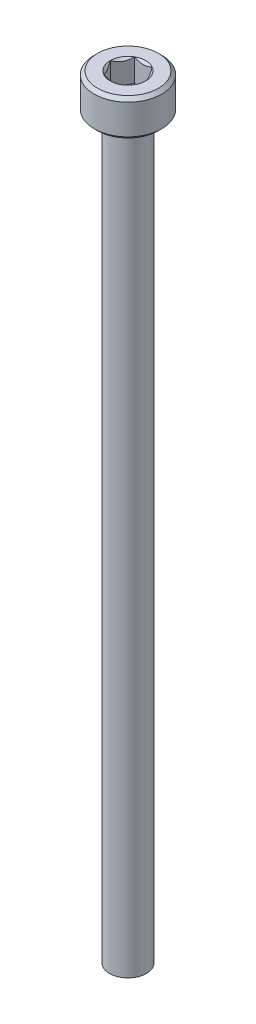
ISO-10303-21;
HEADER;
FILE_DESCRIPTION(('STEP AP214'),'2;1');
FILE_NAME('part.step','',(''),(''),'','','');
FILE_SCHEMA(('AUTOMOTIVE_DESIGN { 1 0 10303 214 1 1 1 1 }'));
ENDSEC;
DATA;
#1=APPLICATION_CONTEXT('core data for automotive mechanical design processes');
#2=APPLICATION_PROTOCOL_DEFINITION('international standard','automotive_design',2000,#1);
#3=PRODUCT_CONTEXT('',#1,'mechanical');
#4=PRODUCT('Part','Part','',(#3));
#5=PRODUCT_RELATED_PRODUCT_CATEGORY('part','',(#4));
#6=PRODUCT_DEFINITION_FORMATION('','',#4);
#7=PRODUCT_DEFINITION_CONTEXT('part definition',#1,'design');
#8=PRODUCT_DEFINITION('design','',#6,#7);
#9=PRODUCT_DEFINITION_SHAPE('','',#8);
#10=(LENGTH_UNIT() NAMED_UNIT(*) SI_UNIT(.MILLI.,.METRE.));
#11=(NAMED_UNIT(*) PLANE_ANGLE_UNIT() SI_UNIT($,.RADIAN.));
#12=(NAMED_UNIT(*) SI_UNIT($,.STERADIAN.) SOLID_ANGLE_UNIT());
#13=UNCERTAINTY_MEASURE_WITH_UNIT(LENGTH_MEASURE(1.E-05),#10,'distance_accuracy_value','');
#14=(GEOMETRIC_REPRESENTATION_CONTEXT(3) GLOBAL_UNCERTAINTY_ASSIGNED_CONTEXT((#13)) GLOBAL_UNIT_ASSIGNED_CONTEXT((#10,
#11,#12)) REPRESENTATION_CONTEXT('',''));
#15=CARTESIAN_POINT('',(0.,0.,0.));
#16=DIRECTION('',(0.,0.,1.));
#17=DIRECTION('',(1.,0.,0.));
#18=AXIS2_PLACEMENT_3D('',#15,#16,#17);
#19=CARTESIAN_POINT('',(0.,3.,0.));
#20=DIRECTION('',(0.,-1.,0.));
#21=DIRECTION('',(0.,0.,-1.));
#22=AXIS2_PLACEMENT_3D('',#19,#20,#21);
#23=CYLINDRICAL_SURFACE('',#22,2.75);
#24=CARTESIAN_POINT('',(0.,0.275000000000001,0.));
#25=DIRECTION('',(0.,1.,0.));
#26=DIRECTION('',(0.,0.,1.));
#27=AXIS2_PLACEMENT_3D('',#24,#25,#26);
#28=CIRCLE('',#27,2.75);
#29=CARTESIAN_POINT('',(0.,0.275000000000001,2.75));
#30=VERTEX_POINT('',#29);
#31=EDGE_CURVE('E227',#30,#30,#28,.T.);
#32=ORIENTED_EDGE('',*,*,#31,.T.);
#33=EDGE_LOOP('',(#32));
#34=FACE_BOUND('',#33,.T.);
#35=CARTESIAN_POINT('',(0.,2.725,0.));
#36=DIRECTION('',(0.,1.,0.));
#37=DIRECTION('',(0.,0.,1.));
#38=AXIS2_PLACEMENT_3D('',#35,#36,#37);
#39=CIRCLE('',#38,2.75);
#40=CARTESIAN_POINT('',(0.,2.725,2.75));
#41=VERTEX_POINT('',#40);
#42=EDGE_CURVE('E104',#41,#41,#39,.F.);
#43=ORIENTED_EDGE('',*,*,#42,.T.);
#44=EDGE_LOOP('',(#43));
#45=FACE_BOUND('',#44,.T.);
#46=ADVANCED_FACE('F32',(#34,#45),#23,.T.);
#47=CARTESIAN_POINT('',(0.,3.,0.));
#48=DIRECTION('',(0.,1.,0.));
#49=DIRECTION('',(0.,0.,1.));
#50=AXIS2_PLACEMENT_3D('',#47,#48,#49);
#51=PLANE('',#50);
#52=CARTESIAN_POINT('',(0.,3.,0.));
#53=DIRECTION('',(0.,1.,0.));
#54=DIRECTION('',(0.,0.,1.));
#55=AXIS2_PLACEMENT_3D('',#52,#53,#54);
#56=CIRCLE('',#55,2.475);
#57=CARTESIAN_POINT('',(0.,3.,2.475));
#58=VERTEX_POINT('',#57);
#59=EDGE_CURVE('E36',#58,#58,#56,.T.);
#60=ORIENTED_EDGE('',*,*,#59,.T.);
#61=EDGE_LOOP('',(#60));
#62=FACE_BOUND('',#61,.T.);
#63=CARTESIAN_POINT('',(0.,3.,0.));
#64=DIRECTION('',(0.,1.,0.));
#65=DIRECTION('',(0.,0.,1.));
#66=AXIS2_PLACEMENT_3D('',#63,#64,#65);
#67=CIRCLE('',#66,1.44337567297406);
#68=CARTESIAN_POINT('',(0.721687836487033,3.,1.25));
#69=VERTEX_POINT('',#68);
#70=CARTESIAN_POINT('',(1.44337567297406,3.,0.));
#71=VERTEX_POINT('',#70);
#72=EDGE_CURVE('E47',#69,#71,#67,.T.);
#73=ORIENTED_EDGE('',*,*,#72,.F.);
#74=CARTESIAN_POINT('',(-0.721687836487033,3.,1.25));
#75=VERTEX_POINT('',#74);
#76=EDGE_CURVE('E54',#75,#69,#67,.T.);
#77=ORIENTED_EDGE('',*,*,#76,.F.);
#78=CARTESIAN_POINT('',(-1.44337567297406,3.,0.));
#79=VERTEX_POINT('',#78);
#80=EDGE_CURVE('E127',#79,#75,#67,.T.);
#81=ORIENTED_EDGE('',*,*,#80,.F.);
#82=CARTESIAN_POINT('',(-0.721687836487033,3.,-1.25));
#83=VERTEX_POINT('',#82);
#84=EDGE_CURVE('E126',#83,#79,#67,.T.);
#85=ORIENTED_EDGE('',*,*,#84,.F.);
#86=CARTESIAN_POINT('',(0.721687836487032,3.,-1.25));
#87=VERTEX_POINT('',#86);
#88=EDGE_CURVE('E94',#87,#83,#67,.T.);
#89=ORIENTED_EDGE('',*,*,#88,.F.);
#90=EDGE_CURVE('E86',#71,#87,#67,.T.);
#91=ORIENTED_EDGE('',*,*,#90,.F.);
#92=EDGE_LOOP('',(#73,#77,#81,#85,#89,#91));
#93=FACE_BOUND('',#92,.T.);
#94=ADVANCED_FACE('F124',(#62,#93),#51,.T.);
#95=CARTESIAN_POINT('',(0.,0.,0.));
#96=DIRECTION('',(0.,1.,0.));
#97=DIRECTION('',(0.,0.,1.));
#98=AXIS2_PLACEMENT_3D('',#95,#96,#97);
#99=PLANE('',#98);
#100=CARTESIAN_POINT('',(0.,0.,0.));
#101=DIRECTION('',(0.,-1.,0.));
#102=DIRECTION('',(0.,0.,-1.));
#103=AXIS2_PLACEMENT_3D('',#100,#101,#102);
#104=CIRCLE('',#103,1.5);
#105=CARTESIAN_POINT('',(0.,0.,-1.5));
#106=VERTEX_POINT('',#105);
#107=EDGE_CURVE('E11',#106,#106,#104,.T.);
#108=ORIENTED_EDGE('',*,*,#107,.F.);
#109=EDGE_LOOP('',(#108));
#110=FACE_BOUND('',#109,.T.);
#111=CARTESIAN_POINT('',(0.,0.,0.));
#112=DIRECTION('',(0.,1.,0.));
#113=DIRECTION('',(0.,0.,1.));
#114=AXIS2_PLACEMENT_3D('',#111,#112,#113);
#115=CIRCLE('',#114,2.475);
#116=CARTESIAN_POINT('',(0.,0.,2.475));
#117=VERTEX_POINT('',#116);
#118=EDGE_CURVE('E225',#117,#117,#115,.F.);
#119=ORIENTED_EDGE('',*,*,#118,.T.);
#120=EDGE_LOOP('',(#119));
#121=FACE_BOUND('',#120,.T.);
#122=ADVANCED_FACE('F208',(#110,#121),#99,.F.);
#123=CARTESIAN_POINT('',(0.,3.,0.));
#124=DIRECTION('',(0.,1.,0.));
#125=DIRECTION('',(0.,0.,1.));
#126=AXIS2_PLACEMENT_3D('',#123,#124,#125);
#127=CONICAL_SURFACE('',#126,1.44337567297406,0.78539816339745);
#128=ORIENTED_EDGE('',*,*,#88,.T.);
#129=CARTESIAN_POINT('',(-1.43934010808077,3.46298209689233,-1.25));
#130=CARTESIAN_POINT('',(-1.40429313005659,3.43652492263289,-1.25));
#131=CARTESIAN_POINT('',(-1.36905087135599,3.41032716035428,-1.25));
#132=CARTESIAN_POINT('',(-1.29809650706311,3.35855757183958,-1.25));
#133=CARTESIAN_POINT('',(-1.26238428576495,3.33298590435629,-1.25));
#134=CARTESIAN_POINT('',(-1.15390111792708,3.25700599368946,-1.25));
#135=CARTESIAN_POINT('',(-1.08031646726264,3.20774028618957,-1.25));
#136=CARTESIAN_POINT('',(-0.926012322755095,3.11102583026313,-1.25));
#137=CARTESIAN_POINT('',(-0.845125318656146,3.0638412989418,-1.25));
#138=CARTESIAN_POINT('',(-0.679311174076602,2.97753073439041,-1.25));
#139=CARTESIAN_POINT('',(-0.594398891026688,2.9383775346269,-1.25));
#140=CARTESIAN_POINT('',(-0.466944812460741,2.89047722368829,-1.25));
#141=CARTESIAN_POINT('',(-0.426289985812822,2.87672948978634,-1.25));
#142=CARTESIAN_POINT('',(-0.343998850091268,2.85249792745054,-1.25));
#143=CARTESIAN_POINT('',(-0.302362473614962,2.84201432386977,-1.25));
#144=CARTESIAN_POINT('',(-0.219052696285666,2.8250301617483,-1.25));
#145=CARTESIAN_POINT('',(-0.1773934284745,2.81846136047137,-1.25));
#146=CARTESIAN_POINT('',(-0.0936293693401924,2.80943505345776,-1.25));
#147=CARTESIAN_POINT('',(-0.0515246558543963,2.80697684099727,-1.25));
#148=CARTESIAN_POINT('',(0.0311890576306314,2.80635406201328,-1.25));
#149=CARTESIAN_POINT('',(0.0717969625499302,2.80803711684625,-1.25));
#150=CARTESIAN_POINT('',(0.152668636885197,2.81526827059791,-1.25));
#151=CARTESIAN_POINT('',(0.192932338835358,2.82081711041311,-1.25));
#152=CARTESIAN_POINT('',(0.273499879165295,2.83557103646495,-1.25));
#153=CARTESIAN_POINT('',(0.313792180618511,2.8448381759641,-1.25));
#154=CARTESIAN_POINT('',(0.393496413911457,2.86653617845735,-1.25));
#155=CARTESIAN_POINT('',(0.432908419115059,2.87896677673064,-1.25));
#156=CARTESIAN_POINT('',(0.556992735862298,2.92277935293144,-1.25));
#157=CARTESIAN_POINT('',(0.639898924666085,2.95915107287596,-1.25));
#158=CARTESIAN_POINT('',(0.801816555499701,3.04001916217833,-1.25));
#159=CARTESIAN_POINT('',(0.880812666325045,3.08454472091199,-1.25));
#160=CARTESIAN_POINT('',(1.0317856127975,3.17640487666662,-1.25));
#161=CARTESIAN_POINT('',(1.10391618485086,3.22348993391625,-1.25));
#162=CARTESIAN_POINT('',(1.21018606043311,3.29627856159854,-1.25));
#163=CARTESIAN_POINT('',(1.24515069969379,3.32079808539336,-1.25));
#164=CARTESIAN_POINT('',(1.31460220852736,3.37048563676568,-1.25));
#165=CARTESIAN_POINT('',(1.34908920596618,3.39565348541552,-1.25));
#166=CARTESIAN_POINT('',(1.38337731682912,3.42109014884121,-1.25));
#167=B_SPLINE_CURVE_WITH_KNOTS('',3,(#129,#130,#131,#132,#133,#134,#135,#136,#137,#138,#139,
#140,#141,#142,#143,#144,#145,#146,#147,#148,#149,#150,#151,#152,#153,#154,#155,#156,#157,#158,
#159,#160,#161,#162,#163,#164,#165,#166),.UNSPECIFIED.,.F.,.F.,(4,2,2,2,2,2,2,2,2,2,2,2,2,2,2,2,
2,2,4),(0.,0.131732960381448,0.263498984161645,0.529042014455825,0.809741926134617,
1.08947609717225,1.21811634272576,1.346765447839,1.47310084517844,1.59941451973784,
1.72115042167849,1.84290966131735,1.96679153905341,2.09066305366039,2.36146692896009,
2.63325989198491,2.89154668212279,3.01965734507713,3.14773302245628),.UNSPECIFIED.);
#168=EDGE_CURVE('E99',#87,#83,#167,.F.);
#169=ORIENTED_EDGE('',*,*,#168,.F.);
#170=EDGE_LOOP('',(#128,#169));
#171=FACE_BOUND('',#170,.T.);
#172=ADVANCED_FACE('F100',(#171),#127,.F.);
#173=ORIENTED_EDGE('',*,*,#84,.T.);
#174=CARTESIAN_POINT('',(-0.721572366433195,3.00011548390914,-1.2502));
#175=CARTESIAN_POINT('',(-0.746384090710444,2.9753216680551,-1.20722483292841));
#176=CARTESIAN_POINT('',(-0.771610739653664,2.95198373441868,-1.16353099525405));
#177=CARTESIAN_POINT('',(-0.823050873919155,2.90925200408454,-1.07443406915806));
#178=CARTESIAN_POINT('',(-0.849269254648333,2.88988199236041,-1.02902250164294));
#179=CARTESIAN_POINT('',(-0.902137405038635,2.85670048341348,-0.937452179064741));
#180=CARTESIAN_POINT('',(-0.928773701756387,2.84280555905266,-0.891316759824115));
#181=CARTESIAN_POINT('',(-0.982632884076012,2.82139728216064,-0.798029919592408));
#182=CARTESIAN_POINT('',(-1.00985412292348,2.81386794156679,-0.750881350863621));
#183=CARTESIAN_POINT('',(-1.05676666578643,2.8070744980507,-0.669626443112748));
#184=CARTESIAN_POINT('',(-1.07639733689152,2.80606855910435,-0.63562512337206));
#185=CARTESIAN_POINT('',(-1.11562418145499,2.80776141491132,-0.567682235567523));
#186=CARTESIAN_POINT('',(-1.1352203463451,2.81046102721554,-0.533740682344343));
#187=CARTESIAN_POINT('',(-1.1742235548576,2.81940893031638,-0.466185143542501));
#188=CARTESIAN_POINT('',(-1.19363040521233,2.82566052589971,-0.432571492713226));
#189=CARTESIAN_POINT('',(-1.23212011385119,2.8413756814139,-0.365905361782188));
#190=CARTESIAN_POINT('',(-1.2512028293628,2.85084062008746,-0.332853128969705));
#191=CARTESIAN_POINT('',(-1.30007715810653,2.87893139068759,-0.248200308399736));
#192=CARTESIAN_POINT('',(-1.32956058931202,2.8996701574522,-0.197133507570362));
#193=CARTESIAN_POINT('',(-1.38737318998519,2.94638713467148,-0.0969991458867452));
#194=CARTESIAN_POINT('',(-1.41570576386268,2.97234829594677,-0.0479256884217304));
#195=CARTESIAN_POINT('',(-1.4434911430279,3.00011548390914,0.000200000000000358));
#196=B_SPLINE_CURVE_WITH_KNOTS('',3,(#174,#175,#176,#177,#178,#179,#180,#181,#182,#183,#184,
#185,#186,#187,#188,#189,#190,#191,#192,#193,#194,#195),.UNSPECIFIED.,.F.,.F.,(4,2,2,2,2,2,2,2,
2,2,4),(0.,0.166533409618303,0.334037607289761,0.498880396489697,0.663307919240274,
0.780963963458826,0.898645970148452,1.01643764860773,1.13427993171549,1.32148652032141,
1.50809158792574),.UNSPECIFIED.);
#197=EDGE_CURVE('E129',#83,#79,#196,.T.);
#198=ORIENTED_EDGE('',*,*,#197,.F.);
#199=EDGE_LOOP('',(#173,#198));
#200=FACE_BOUND('',#199,.T.);
#201=ADVANCED_FACE('F240',(#200),#127,.F.);
#202=ORIENTED_EDGE('',*,*,#80,.T.);
#203=CARTESIAN_POINT('',(-1.4434911430279,3.00011548390914,-0.000199999999999785));
#204=CARTESIAN_POINT('',(-1.41867941875065,2.9753216680551,0.0427751670715869));
#205=CARTESIAN_POINT('',(-1.39345276980743,2.95198373441868,0.0864690047459481));
#206=CARTESIAN_POINT('',(-1.34201263554194,2.90925200408454,0.175565930841942));
#207=CARTESIAN_POINT('',(-1.31579425481276,2.88988199236041,0.220977498357064));
#208=CARTESIAN_POINT('',(-1.26292610442246,2.85670048341348,0.31254782093526));
#209=CARTESIAN_POINT('',(-1.23628980770471,2.84280555905266,0.358683240175886));
#210=CARTESIAN_POINT('',(-1.18243062538508,2.82139728216064,0.451970080407593));
#211=CARTESIAN_POINT('',(-1.15520938653761,2.81386794156679,0.49911864913638));
#212=CARTESIAN_POINT('',(-1.10829684367467,2.8070744980507,0.580373556887253));
#213=CARTESIAN_POINT('',(-1.08866617256958,2.80606855910435,0.614374876627941));
#214=CARTESIAN_POINT('',(-1.04943932800611,2.80776141491132,0.682317764432478));
#215=CARTESIAN_POINT('',(-1.02984316311599,2.81046102721554,0.716259317655658));
#216=CARTESIAN_POINT('',(-0.990839954603499,2.81940893031638,0.7838148564575));
#217=CARTESIAN_POINT('',(-0.971433104248771,2.82566052589971,0.817428507286775));
#218=CARTESIAN_POINT('',(-0.932943395609905,2.8413756814139,0.884094638217813));
#219=CARTESIAN_POINT('',(-0.9138606800983,2.85084062008746,0.917146871030296));
#220=CARTESIAN_POINT('',(-0.864986351354568,2.87893139068759,1.00179969160026));
#221=CARTESIAN_POINT('',(-0.835502920149076,2.8996701574522,1.05286649242964));
#222=CARTESIAN_POINT('',(-0.777690319475909,2.94638713467148,1.15300085411325));
#223=CARTESIAN_POINT('',(-0.749357745598417,2.97234829594677,1.20207431157827));
#224=CARTESIAN_POINT('',(-0.721572366433195,3.00011548390914,1.2502));
#225=B_SPLINE_CURVE_WITH_KNOTS('',3,(#203,#204,#205,#206,#207,#208,#209,#210,#211,#212,#213,
#214,#215,#216,#217,#218,#219,#220,#221,#222,#223,#224),.UNSPECIFIED.,.F.,.F.,(4,2,2,2,2,2,2,2,
2,2,4),(0.,0.166533409618303,0.334037607289761,0.498880396489698,0.663307919240275,
0.780963963458827,0.898645970148453,1.01643764860773,1.1342799317155,1.32148652032141,
1.50809158792573),.UNSPECIFIED.);
#226=EDGE_CURVE('E139',#79,#75,#225,.T.);
#227=ORIENTED_EDGE('',*,*,#226,.F.);
#228=EDGE_LOOP('',(#202,#227));
#229=FACE_BOUND('',#228,.T.);
#230=ADVANCED_FACE('F256',(#229),#127,.F.);
#231=ORIENTED_EDGE('',*,*,#76,.T.);
#232=CARTESIAN_POINT('',(-1.43934010808077,3.46298209689233,1.25));
#233=CARTESIAN_POINT('',(-1.40429313005659,3.43652492263289,1.25));
#234=CARTESIAN_POINT('',(-1.36905087135599,3.41032716035428,1.25));
#235=CARTESIAN_POINT('',(-1.29809650706311,3.35855757183958,1.25));
#236=CARTESIAN_POINT('',(-1.26238428576495,3.33298590435629,1.25));
#237=CARTESIAN_POINT('',(-1.15390111792708,3.25700599368946,1.25));
#238=CARTESIAN_POINT('',(-1.08031646726264,3.20774028618957,1.25));
#239=CARTESIAN_POINT('',(-0.926012322755096,3.11102583026313,1.25));
#240=CARTESIAN_POINT('',(-0.845125318656147,3.0638412989418,1.25));
#241=CARTESIAN_POINT('',(-0.679311174076603,2.97753073439041,1.25));
#242=CARTESIAN_POINT('',(-0.594398891026688,2.9383775346269,1.25));
#243=CARTESIAN_POINT('',(-0.46694481246074,2.89047722368829,1.25));
#244=CARTESIAN_POINT('',(-0.426289985812822,2.87672948978634,1.25));
#245=CARTESIAN_POINT('',(-0.343998850091268,2.85249792745054,1.25));
#246=CARTESIAN_POINT('',(-0.302362473614962,2.84201432386977,1.25));
#247=CARTESIAN_POINT('',(-0.219052696285665,2.8250301617483,1.25));
#248=CARTESIAN_POINT('',(-0.1773934284745,2.81846136047137,1.25));
#249=CARTESIAN_POINT('',(-0.0936293693401921,2.80943505345776,1.25));
#250=CARTESIAN_POINT('',(-0.051524655854396,2.80697684099727,1.25));
#251=CARTESIAN_POINT('',(0.0311890576306315,2.80635406201328,1.25));
#252=CARTESIAN_POINT('',(0.0717969625499303,2.80803711684625,1.25));
#253=CARTESIAN_POINT('',(0.152668636885197,2.81526827059791,1.25));
#254=CARTESIAN_POINT('',(0.192932338835358,2.82081711041311,1.25));
#255=CARTESIAN_POINT('',(0.273499879165295,2.83557103646495,1.25));
#256=CARTESIAN_POINT('',(0.313792180618511,2.8448381759641,1.25));
#257=CARTESIAN_POINT('',(0.393496413911457,2.86653617845735,1.25));
#258=CARTESIAN_POINT('',(0.432908419115059,2.87896677673064,1.25));
#259=CARTESIAN_POINT('',(0.556992735862298,2.92277935293144,1.25));
#260=CARTESIAN_POINT('',(0.639898924666085,2.95915107287595,1.25));
#261=CARTESIAN_POINT('',(0.801816555499701,3.04001916217833,1.25));
#262=CARTESIAN_POINT('',(0.880812666325044,3.08454472091198,1.25));
#263=CARTESIAN_POINT('',(1.0317856127975,3.17640487666662,1.25));
#264=CARTESIAN_POINT('',(1.10391618485086,3.22348993391625,1.25));
#265=CARTESIAN_POINT('',(1.2101860604331,3.29627856159854,1.25));
#266=CARTESIAN_POINT('',(1.24515069969379,3.32079808539336,1.25));
#267=CARTESIAN_POINT('',(1.31460220852736,3.37048563676568,1.25));
#268=CARTESIAN_POINT('',(1.34908920596618,3.39565348541552,1.25));
#269=CARTESIAN_POINT('',(1.38337731682911,3.42109014884121,1.25));
#270=B_SPLINE_CURVE_WITH_KNOTS('',3,(#232,#233,#234,#235,#236,#237,#238,#239,#240,#241,#242,
#243,#244,#245,#246,#247,#248,#249,#250,#251,#252,#253,#254,#255,#256,#257,#258,#259,#260,#261,
#262,#263,#264,#265,#266,#267,#268,#269),.UNSPECIFIED.,.F.,.F.,(4,2,2,2,2,2,2,2,2,2,2,2,2,2,2,2,
2,2,4),(0.,0.131732960381448,0.263498984161645,0.529042014455826,0.809741926134619,
1.08947609717225,1.21811634272577,1.34676544783901,1.47310084517844,1.59941451973785,
1.7211504216785,1.84290966131735,1.96679153905342,2.09066305366039,2.36146692896009,
2.63325989198491,2.89154668212279,3.01965734507713,3.14773302245628),.UNSPECIFIED.);
#271=EDGE_CURVE('E168',#75,#69,#270,.T.);
#272=ORIENTED_EDGE('',*,*,#271,.F.);
#273=EDGE_LOOP('',(#231,#272));
#274=FACE_BOUND('',#273,.T.);
#275=ADVANCED_FACE('F286',(#274),#127,.F.);
#276=ORIENTED_EDGE('',*,*,#72,.T.);
#277=CARTESIAN_POINT('',(0.721572366433194,3.00011548390914,1.2502));
#278=CARTESIAN_POINT('',(0.746384090710444,2.9753216680551,1.20722483292841));
#279=CARTESIAN_POINT('',(0.771610739653664,2.95198373441868,1.16353099525405));
#280=CARTESIAN_POINT('',(0.823050873919154,2.90925200408454,1.07443406915806));
#281=CARTESIAN_POINT('',(0.849269254648333,2.88988199236041,1.02902250164294));
#282=CARTESIAN_POINT('',(0.902137405038635,2.85670048341348,0.93745217906474));
#283=CARTESIAN_POINT('',(0.928773701756386,2.84280555905266,0.891316759824115));
#284=CARTESIAN_POINT('',(0.982632884076012,2.82139728216064,0.798029919592408));
#285=CARTESIAN_POINT('',(1.00985412292348,2.81386794156679,0.750881350863621));
#286=CARTESIAN_POINT('',(1.05676666578643,2.8070744980507,0.669626443112748));
#287=CARTESIAN_POINT('',(1.07639733689152,2.80606855910435,0.63562512337206));
#288=CARTESIAN_POINT('',(1.11562418145499,2.80776141491132,0.567682235567523));
#289=CARTESIAN_POINT('',(1.1352203463451,2.81046102721554,0.533740682344343));
#290=CARTESIAN_POINT('',(1.1742235548576,2.81940893031638,0.466185143542501));
#291=CARTESIAN_POINT('',(1.19363040521232,2.8256605258997,0.432571492713226));
#292=CARTESIAN_POINT('',(1.23212011385119,2.8413756814139,0.365905361782188));
#293=CARTESIAN_POINT('',(1.2512028293628,2.85084062008746,0.332853128969705));
#294=CARTESIAN_POINT('',(1.30007715810653,2.87893139068759,0.248200308399736));
#295=CARTESIAN_POINT('',(1.32956058931202,2.8996701574522,0.197133507570362));
#296=CARTESIAN_POINT('',(1.38737318998519,2.94638713467148,0.096999145886745));
#297=CARTESIAN_POINT('',(1.41570576386268,2.97234829594677,0.04792568842173));
#298=CARTESIAN_POINT('',(1.4434911430279,3.00011548390914,-0.000200000000000782));
#299=B_SPLINE_CURVE_WITH_KNOTS('',3,(#277,#278,#279,#280,#281,#282,#283,#284,#285,#286,#287,
#288,#289,#290,#291,#292,#293,#294,#295,#296,#297,#298),.UNSPECIFIED.,.F.,.F.,(4,2,2,2,2,2,2,2,
2,2,4),(0.,0.166533409618303,0.334037607289761,0.498880396489697,0.663307919240274,
0.780963963458826,0.898645970148452,1.01643764860773,1.13427993171549,1.32148652032141,
1.50809158792574),.UNSPECIFIED.);
#300=EDGE_CURVE('E114',#69,#71,#299,.T.);
#301=ORIENTED_EDGE('',*,*,#300,.F.);
#302=EDGE_LOOP('',(#276,#301));
#303=FACE_BOUND('',#302,.T.);
#304=ADVANCED_FACE('F154',(#303),#127,.F.);
#305=ORIENTED_EDGE('',*,*,#90,.T.);
#306=CARTESIAN_POINT('',(1.4434911430279,3.00011548390914,0.000199999999999333));
#307=CARTESIAN_POINT('',(1.41867941875065,2.9753216680551,-0.0427751670715874));
#308=CARTESIAN_POINT('',(1.39345276980743,2.95198373441868,-0.0864690047459486));
#309=CARTESIAN_POINT('',(1.34201263554194,2.90925200408454,-0.175565930841942));
#310=CARTESIAN_POINT('',(1.31579425481276,2.88988199236041,-0.220977498357064));
#311=CARTESIAN_POINT('',(1.26292610442246,2.85670048341348,-0.31254782093526));
#312=CARTESIAN_POINT('',(1.23628980770471,2.84280555905266,-0.358683240175886));
#313=CARTESIAN_POINT('',(1.18243062538508,2.82139728216064,-0.451970080407593));
#314=CARTESIAN_POINT('',(1.15520938653761,2.81386794156679,-0.49911864913638));
#315=CARTESIAN_POINT('',(1.10829684367467,2.8070744980507,-0.580373556887252));
#316=CARTESIAN_POINT('',(1.08866617256958,2.80606855910435,-0.614374876627941));
#317=CARTESIAN_POINT('',(1.04943932800611,2.80776141491132,-0.682317764432477));
#318=CARTESIAN_POINT('',(1.02984316311599,2.81046102721554,-0.716259317655657));
#319=CARTESIAN_POINT('',(0.990839954603499,2.81940893031638,-0.783814856457499));
#320=CARTESIAN_POINT('',(0.971433104248771,2.82566052589971,-0.817428507286775));
#321=CARTESIAN_POINT('',(0.932943395609905,2.8413756814139,-0.884094638217813));
#322=CARTESIAN_POINT('',(0.9138606800983,2.85084062008746,-0.917146871030295));
#323=CARTESIAN_POINT('',(0.864986351354567,2.87893139068759,-1.00179969160026));
#324=CARTESIAN_POINT('',(0.835502920149075,2.8996701574522,-1.05286649242964));
#325=CARTESIAN_POINT('',(0.777690319475908,2.94638713467148,-1.15300085411326));
#326=CARTESIAN_POINT('',(0.749357745598416,2.97234829594677,-1.20207431157827));
#327=CARTESIAN_POINT('',(0.721572366433194,3.00011548390914,-1.2502));
#328=B_SPLINE_CURVE_WITH_KNOTS('',3,(#306,#307,#308,#309,#310,#311,#312,#313,#314,#315,#316,
#317,#318,#319,#320,#321,#322,#323,#324,#325,#326,#327),.UNSPECIFIED.,.F.,.F.,(4,2,2,2,2,2,2,2,
2,2,4),(0.,0.166533409618303,0.334037607289761,0.498880396489698,0.663307919240274,
0.780963963458826,0.898645970148452,1.01643764860773,1.13427993171549,1.32148652032141,
1.50809158792574),.UNSPECIFIED.);
#329=EDGE_CURVE('E90',#71,#87,#328,.T.);
#330=ORIENTED_EDGE('',*,*,#329,.F.);
#331=EDGE_LOOP('',(#305,#330));
#332=FACE_BOUND('',#331,.T.);
#333=ADVANCED_FACE('F88',(#332),#127,.F.);
#334=CARTESIAN_POINT('',(0.,1.12,0.));
#335=DIRECTION('',(0.,1.,0.));
#336=DIRECTION('',(0.,0.,1.));
#337=AXIS2_PLACEMENT_3D('',#334,#335,#336);
#338=PLANE('',#337);
#339=DIRECTION('',(-0.5,0.,-0.866025403784438));
#340=VECTOR('',#339,1.);
#341=CARTESIAN_POINT('',(1.44337567297406,1.12,0.));
#342=LINE('',#341,#340);
#343=CARTESIAN_POINT('',(1.44337567297406,1.12,0.));
#344=VERTEX_POINT('',#343);
#345=CARTESIAN_POINT('',(0.721687836487032,1.12,-1.25));
#346=VERTEX_POINT('',#345);
#347=EDGE_CURVE('E113',#344,#346,#342,.T.);
#348=ORIENTED_EDGE('',*,*,#347,.T.);
#349=DIRECTION('',(-1.,0.,0.));
#350=VECTOR('',#349,1.);
#351=CARTESIAN_POINT('',(0.721687836487032,1.12,-1.25));
#352=LINE('',#351,#350);
#353=CARTESIAN_POINT('',(-0.721687836487032,1.12,-1.25));
#354=VERTEX_POINT('',#353);
#355=EDGE_CURVE('E118',#346,#354,#352,.T.);
#356=ORIENTED_EDGE('',*,*,#355,.T.);
#357=DIRECTION('',(-0.5,0.,0.866025403784439));
#358=VECTOR('',#357,1.);
#359=CARTESIAN_POINT('',(-0.721687836487032,1.12,-1.25));
#360=LINE('',#359,#358);
#361=CARTESIAN_POINT('',(-1.44337567297406,1.12,0.));
#362=VERTEX_POINT('',#361);
#363=EDGE_CURVE('E280',#354,#362,#360,.T.);
#364=ORIENTED_EDGE('',*,*,#363,.T.);
#365=DIRECTION('',(0.5,0.,0.866025403784439));
#366=VECTOR('',#365,1.);
#367=CARTESIAN_POINT('',(-1.44337567297406,1.12,0.));
#368=LINE('',#367,#366);
#369=CARTESIAN_POINT('',(-0.721687836487033,1.12,1.25));
#370=VERTEX_POINT('',#369);
#371=EDGE_CURVE('E263',#362,#370,#368,.T.);
#372=ORIENTED_EDGE('',*,*,#371,.T.);
#373=DIRECTION('',(1.,0.,0.));
#374=VECTOR('',#373,1.);
#375=CARTESIAN_POINT('',(-0.721687836487033,1.12,1.25));
#376=LINE('',#375,#374);
#377=CARTESIAN_POINT('',(0.721687836487032,1.12,1.25));
#378=VERTEX_POINT('',#377);
#379=EDGE_CURVE('E276',#370,#378,#376,.T.);
#380=ORIENTED_EDGE('',*,*,#379,.T.);
#381=DIRECTION('',(0.5,0.,-0.866025403784439));
#382=VECTOR('',#381,1.);
#383=CARTESIAN_POINT('',(0.721687836487032,1.12,1.25));
#384=LINE('',#383,#382);
#385=EDGE_CURVE('E121',#378,#344,#384,.T.);
#386=ORIENTED_EDGE('',*,*,#385,.T.);
#387=EDGE_LOOP('',(#348,#356,#364,#372,#380,#386));
#388=FACE_BOUND('',#387,.T.);
#389=ADVANCED_FACE('F153',(#388),#338,.T.);
#390=CARTESIAN_POINT('',(0.721687836487032,1.12,-1.25));
#391=DIRECTION('',(0.,0.,-1.));
#392=DIRECTION('',(-1.,0.,0.));
#393=AXIS2_PLACEMENT_3D('',#390,#391,#392);
#394=PLANE('',#393);
#395=DIRECTION('',(0.,1.,0.));
#396=VECTOR('',#395,1.);
#397=CARTESIAN_POINT('',(0.721687836487032,1.12,-1.25));
#398=LINE('',#397,#396);
#399=EDGE_CURVE('E111',#346,#87,#398,.T.);
#400=ORIENTED_EDGE('',*,*,#399,.T.);
#401=ORIENTED_EDGE('',*,*,#168,.T.);
#402=DIRECTION('',(0.,1.,0.));
#403=VECTOR('',#402,1.);
#404=CARTESIAN_POINT('',(-0.721687836487032,1.12,-1.25));
#405=LINE('',#404,#403);
#406=EDGE_CURVE('E120',#354,#83,#405,.T.);
#407=ORIENTED_EDGE('',*,*,#406,.F.);
#408=ORIENTED_EDGE('',*,*,#355,.F.);
#409=EDGE_LOOP('',(#400,#401,#407,#408));
#410=FACE_BOUND('',#409,.T.);
#411=ADVANCED_FACE('F116',(#410),#394,.F.);
#412=CARTESIAN_POINT('',(-0.721687836487032,1.12,-1.25));
#413=DIRECTION('',(-0.866025403784439,0.,-0.5));
#414=DIRECTION('',(-0.5,0.,0.866025403784439));
#415=AXIS2_PLACEMENT_3D('',#412,#413,#414);
#416=PLANE('',#415);
#417=ORIENTED_EDGE('',*,*,#406,.T.);
#418=ORIENTED_EDGE('',*,*,#197,.T.);
#419=DIRECTION('',(0.,1.,0.));
#420=VECTOR('',#419,1.);
#421=CARTESIAN_POINT('',(-1.44337567297406,1.12,0.));
#422=LINE('',#421,#420);
#423=EDGE_CURVE('E259',#362,#79,#422,.T.);
#424=ORIENTED_EDGE('',*,*,#423,.F.);
#425=ORIENTED_EDGE('',*,*,#363,.F.);
#426=EDGE_LOOP('',(#417,#418,#424,#425));
#427=FACE_BOUND('',#426,.T.);
#428=ADVANCED_FACE('F146',(#427),#416,.F.);
#429=CARTESIAN_POINT('',(-1.44337567297406,1.12,0.));
#430=DIRECTION('',(-0.866025403784439,0.,0.5));
#431=DIRECTION('',(0.5,0.,0.866025403784439));
#432=AXIS2_PLACEMENT_3D('',#429,#430,#431);
#433=PLANE('',#432);
#434=ORIENTED_EDGE('',*,*,#423,.T.);
#435=ORIENTED_EDGE('',*,*,#226,.T.);
#436=DIRECTION('',(0.,1.,0.));
#437=VECTOR('',#436,1.);
#438=CARTESIAN_POINT('',(-0.721687836487033,1.12,1.25));
#439=LINE('',#438,#437);
#440=EDGE_CURVE('E265',#370,#75,#439,.T.);
#441=ORIENTED_EDGE('',*,*,#440,.F.);
#442=ORIENTED_EDGE('',*,*,#371,.F.);
#443=EDGE_LOOP('',(#434,#435,#441,#442));
#444=FACE_BOUND('',#443,.T.);
#445=ADVANCED_FACE('F192',(#444),#433,.F.);
#446=CARTESIAN_POINT('',(-0.721687836487033,1.12,1.25));
#447=DIRECTION('',(0.,0.,1.));
#448=DIRECTION('',(1.,0.,0.));
#449=AXIS2_PLACEMENT_3D('',#446,#447,#448);
#450=PLANE('',#449);
#451=ORIENTED_EDGE('',*,*,#440,.T.);
#452=ORIENTED_EDGE('',*,*,#271,.T.);
#453=DIRECTION('',(0.,1.,0.));
#454=VECTOR('',#453,1.);
#455=CARTESIAN_POINT('',(0.721687836487032,1.12,1.25));
#456=LINE('',#455,#454);
#457=EDGE_CURVE('E267',#378,#69,#456,.T.);
#458=ORIENTED_EDGE('',*,*,#457,.F.);
#459=ORIENTED_EDGE('',*,*,#379,.F.);
#460=EDGE_LOOP('',(#451,#452,#458,#459));
#461=FACE_BOUND('',#460,.T.);
#462=ADVANCED_FACE('F188',(#461),#450,.F.);
#463=CARTESIAN_POINT('',(0.721687836487032,1.12,1.25));
#464=DIRECTION('',(0.866025403784439,0.,0.5));
#465=DIRECTION('',(0.5,0.,-0.866025403784439));
#466=AXIS2_PLACEMENT_3D('',#463,#464,#465);
#467=PLANE('',#466);
#468=ORIENTED_EDGE('',*,*,#457,.T.);
#469=ORIENTED_EDGE('',*,*,#300,.T.);
#470=DIRECTION('',(0.,1.,0.));
#471=VECTOR('',#470,1.);
#472=CARTESIAN_POINT('',(1.44337567297406,1.12,0.));
#473=LINE('',#472,#471);
#474=EDGE_CURVE('E105',#344,#71,#473,.T.);
#475=ORIENTED_EDGE('',*,*,#474,.F.);
#476=ORIENTED_EDGE('',*,*,#385,.F.);
#477=EDGE_LOOP('',(#468,#469,#475,#476));
#478=FACE_BOUND('',#477,.T.);
#479=ADVANCED_FACE('F185',(#478),#467,.F.);
#480=CARTESIAN_POINT('',(1.44337567297406,1.12,0.));
#481=DIRECTION('',(0.866025403784438,0.,-0.5));
#482=DIRECTION('',(-0.5,0.,-0.866025403784439));
#483=AXIS2_PLACEMENT_3D('',#480,#481,#482);
#484=PLANE('',#483);
#485=ORIENTED_EDGE('',*,*,#474,.T.);
#486=ORIENTED_EDGE('',*,*,#329,.T.);
#487=ORIENTED_EDGE('',*,*,#399,.F.);
#488=ORIENTED_EDGE('',*,*,#347,.F.);
#489=EDGE_LOOP('',(#485,#486,#487,#488));
#490=FACE_BOUND('',#489,.T.);
#491=ADVANCED_FACE('F109',(#490),#484,.F.);
#492=CARTESIAN_POINT('',(0.,0.275000000000001,0.));
#493=DIRECTION('',(0.,1.,0.));
#494=DIRECTION('',(0.,0.,1.));
#495=AXIS2_PLACEMENT_3D('',#492,#493,#494);
#496=CONICAL_SURFACE('',#495,2.75,0.785398163397451);
#497=ORIENTED_EDGE('',*,*,#118,.F.);
#498=EDGE_LOOP('',(#497));
#499=FACE_BOUND('',#498,.T.);
#500=ORIENTED_EDGE('',*,*,#31,.F.);
#501=EDGE_LOOP('',(#500));
#502=FACE_BOUND('',#501,.T.);
#503=ADVANCED_FACE('F214',(#499,#502),#496,.T.);
#504=CARTESIAN_POINT('',(0.,3.,0.));
#505=DIRECTION('',(0.,-1.,0.));
#506=DIRECTION('',(0.,0.,-1.));
#507=AXIS2_PLACEMENT_3D('',#504,#505,#506);
#508=CONICAL_SURFACE('',#507,2.475,0.785398163397447);
#509=ORIENTED_EDGE('',*,*,#42,.F.);
#510=EDGE_LOOP('',(#509));
#511=FACE_BOUND('',#510,.T.);
#512=ORIENTED_EDGE('',*,*,#59,.F.);
#513=EDGE_LOOP('',(#512));
#514=FACE_BOUND('',#513,.T.);
#515=ADVANCED_FACE('F34',(#511,#514),#508,.T.);
#516=CARTESIAN_POINT('',(0.,-60.,0.));
#517=DIRECTION('',(0.,1.,0.));
#518=DIRECTION('',(0.,0.,1.));
#519=AXIS2_PLACEMENT_3D('',#516,#517,#518);
#520=CYLINDRICAL_SURFACE('',#519,1.5);
#521=CARTESIAN_POINT('',(0.,-60.,0.));
#522=DIRECTION('',(0.,-1.,0.));
#523=DIRECTION('',(0.,0.,-1.));
#524=AXIS2_PLACEMENT_3D('',#521,#522,#523);
#525=CIRCLE('',#524,1.5);
#526=CARTESIAN_POINT('',(0.,-60.,-1.5));
#527=VERTEX_POINT('',#526);
#528=EDGE_CURVE('E252',#527,#527,#525,.T.);
#529=ORIENTED_EDGE('',*,*,#528,.F.);
#530=EDGE_LOOP('',(#529));
#531=FACE_BOUND('',#530,.T.);
#532=ORIENTED_EDGE('',*,*,#107,.T.);
#533=EDGE_LOOP('',(#532));
#534=FACE_BOUND('',#533,.T.);
#535=ADVANCED_FACE('F155',(#531,#534),#520,.T.);
#536=CARTESIAN_POINT('',(0.,-60.,0.));
#537=DIRECTION('',(0.,-1.,0.));
#538=DIRECTION('',(0.,0.,-1.));
#539=AXIS2_PLACEMENT_3D('',#536,#537,#538);
#540=PLANE('',#539);
#541=ORIENTED_EDGE('',*,*,#528,.T.);
#542=EDGE_LOOP('',(#541));
#543=FACE_BOUND('',#542,.T.);
#544=ADVANCED_FACE('F244',(#543),#540,.T.);
#545=CLOSED_SHELL('',(#46,#94,#122,#172,#201,#230,#275,#304,#333,#389,#411,#428,#445,#462,#479,
#491,#503,#515,#535,#544));
#546=MANIFOLD_SOLID_BREP('B2',#545);
#547=ADVANCED_BREP_SHAPE_REPRESENTATION('',(#18,#546),#14);
#548=SHAPE_DEFINITION_REPRESENTATION(#9,#547);
ENDSEC;
END-ISO-10303-21;
